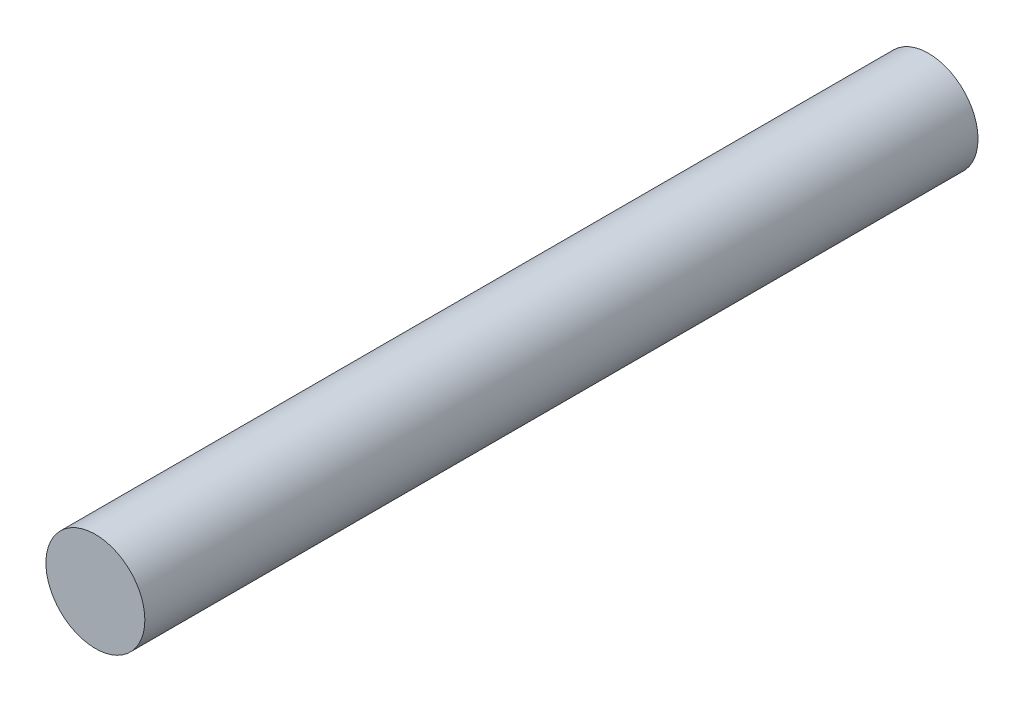
ISO-10303-21;
HEADER;
FILE_DESCRIPTION(('STEP AP214'),'2;1');
FILE_NAME('part.step','',(''),(''),'','','');
FILE_SCHEMA(('AUTOMOTIVE_DESIGN { 1 0 10303 214 1 1 1 1 }'));
ENDSEC;
DATA;
#1=APPLICATION_CONTEXT('core data for automotive mechanical design processes');
#2=APPLICATION_PROTOCOL_DEFINITION('international standard','automotive_design',2000,#1);
#3=PRODUCT_CONTEXT('',#1,'mechanical');
#4=PRODUCT('Part','Part','',(#3));
#5=PRODUCT_RELATED_PRODUCT_CATEGORY('part','',(#4));
#6=PRODUCT_DEFINITION_FORMATION('','',#4);
#7=PRODUCT_DEFINITION_CONTEXT('part definition',#1,'design');
#8=PRODUCT_DEFINITION('design','',#6,#7);
#9=PRODUCT_DEFINITION_SHAPE('','',#8);
#10=(LENGTH_UNIT() NAMED_UNIT(*) SI_UNIT(.MILLI.,.METRE.));
#11=(NAMED_UNIT(*) PLANE_ANGLE_UNIT() SI_UNIT($,.RADIAN.));
#12=(NAMED_UNIT(*) SI_UNIT($,.STERADIAN.) SOLID_ANGLE_UNIT());
#13=UNCERTAINTY_MEASURE_WITH_UNIT(LENGTH_MEASURE(1.E-05),#10,'distance_accuracy_value','');
#14=(GEOMETRIC_REPRESENTATION_CONTEXT(3) GLOBAL_UNCERTAINTY_ASSIGNED_CONTEXT((#13)) GLOBAL_UNIT_ASSIGNED_CONTEXT((#10,
#11,#12)) REPRESENTATION_CONTEXT('',''));
#15=CARTESIAN_POINT('',(0.,0.,0.));
#16=DIRECTION('',(0.,0.,1.));
#17=DIRECTION('',(1.,0.,0.));
#18=AXIS2_PLACEMENT_3D('',#15,#16,#17);
#19=CARTESIAN_POINT('',(0.,0.,24.));
#20=DIRECTION('',(0.,0.,-1.));
#21=DIRECTION('',(-1.,0.,0.));
#22=AXIS2_PLACEMENT_3D('',#19,#20,#21);
#23=CYLINDRICAL_SURFACE('',#22,1.425);
#24=CARTESIAN_POINT('',(0.,0.,24.));
#25=DIRECTION('',(0.,0.,1.));
#26=DIRECTION('',(1.,0.,0.));
#27=AXIS2_PLACEMENT_3D('',#24,#25,#26);
#28=CIRCLE('',#27,1.425);
#29=CARTESIAN_POINT('',(1.425,0.,24.));
#30=VERTEX_POINT('',#29);
#31=EDGE_CURVE('E10',#30,#30,#28,.T.);
#32=ORIENTED_EDGE('',*,*,#31,.F.);
#33=EDGE_LOOP('',(#32));
#34=FACE_BOUND('',#33,.T.);
#35=CARTESIAN_POINT('',(0.,0.,0.));
#36=DIRECTION('',(0.,0.,1.));
#37=DIRECTION('',(1.,0.,0.));
#38=AXIS2_PLACEMENT_3D('',#35,#36,#37);
#39=CIRCLE('',#38,1.425);
#40=CARTESIAN_POINT('',(1.425,0.,0.));
#41=VERTEX_POINT('',#40);
#42=EDGE_CURVE('E38',#41,#41,#39,.T.);
#43=ORIENTED_EDGE('',*,*,#42,.T.);
#44=EDGE_LOOP('',(#43));
#45=FACE_BOUND('',#44,.T.);
#46=ADVANCED_FACE('F35',(#34,#45),#23,.T.);
#47=CARTESIAN_POINT('',(0.,0.,24.));
#48=DIRECTION('',(0.,0.,1.));
#49=DIRECTION('',(1.,0.,0.));
#50=AXIS2_PLACEMENT_3D('',#47,#48,#49);
#51=PLANE('',#50);
#52=ORIENTED_EDGE('',*,*,#31,.T.);
#53=EDGE_LOOP('',(#52));
#54=FACE_BOUND('',#53,.T.);
#55=ADVANCED_FACE('F51',(#54),#51,.T.);
#56=CARTESIAN_POINT('',(0.,0.,0.));
#57=DIRECTION('',(0.,0.,1.));
#58=DIRECTION('',(1.,0.,0.));
#59=AXIS2_PLACEMENT_3D('',#56,#57,#58);
#60=PLANE('',#59);
#61=ORIENTED_EDGE('',*,*,#42,.F.);
#62=EDGE_LOOP('',(#61));
#63=FACE_BOUND('',#62,.T.);
#64=ADVANCED_FACE('F49',(#63),#60,.F.);
#65=CLOSED_SHELL('',(#46,#55,#64));
#66=MANIFOLD_SOLID_BREP('B2',#65);
#67=ADVANCED_BREP_SHAPE_REPRESENTATION('',(#18,#66),#14);
#68=SHAPE_DEFINITION_REPRESENTATION(#9,#67);
ENDSEC;
END-ISO-10303-21;
